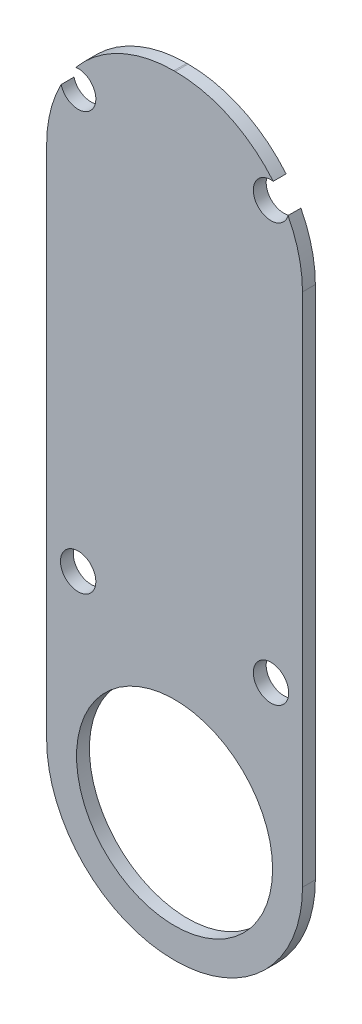
ISO-10303-21;
HEADER;
FILE_DESCRIPTION(('STEP AP214'),'2;1');
FILE_NAME('part.step','',(''),(''),'','','');
FILE_SCHEMA(('AUTOMOTIVE_DESIGN { 1 0 10303 214 1 1 1 1 }'));
ENDSEC;
DATA;
#1=APPLICATION_CONTEXT('core data for automotive mechanical design processes');
#2=APPLICATION_PROTOCOL_DEFINITION('international standard','automotive_design',2000,#1);
#3=PRODUCT_CONTEXT('',#1,'mechanical');
#4=PRODUCT('Part','Part','',(#3));
#5=PRODUCT_RELATED_PRODUCT_CATEGORY('part','',(#4));
#6=PRODUCT_DEFINITION_FORMATION('','',#4);
#7=PRODUCT_DEFINITION_CONTEXT('part definition',#1,'design');
#8=PRODUCT_DEFINITION('design','',#6,#7);
#9=PRODUCT_DEFINITION_SHAPE('','',#8);
#10=(LENGTH_UNIT() NAMED_UNIT(*) SI_UNIT(.MILLI.,.METRE.));
#11=(NAMED_UNIT(*) PLANE_ANGLE_UNIT() SI_UNIT($,.RADIAN.));
#12=(NAMED_UNIT(*) SI_UNIT($,.STERADIAN.) SOLID_ANGLE_UNIT());
#13=UNCERTAINTY_MEASURE_WITH_UNIT(LENGTH_MEASURE(1.E-05),#10,'distance_accuracy_value','');
#14=(GEOMETRIC_REPRESENTATION_CONTEXT(3) GLOBAL_UNCERTAINTY_ASSIGNED_CONTEXT((#13)) GLOBAL_UNIT_ASSIGNED_CONTEXT((#10,
#11,#12)) REPRESENTATION_CONTEXT('',''));
#15=CARTESIAN_POINT('',(0.,0.,0.));
#16=DIRECTION('',(0.,0.,1.));
#17=DIRECTION('',(1.,0.,0.));
#18=AXIS2_PLACEMENT_3D('',#15,#16,#17);
#19=CARTESIAN_POINT('',(100.1,-84.9,4.));
#20=DIRECTION('',(0.,0.,-1.));
#21=DIRECTION('',(-1.,0.,0.));
#22=AXIS2_PLACEMENT_3D('',#19,#20,#21);
#23=CYLINDRICAL_SURFACE('',#22,19.8);
#24=CARTESIAN_POINT('',(100.1,-84.9,2.));
#25=DIRECTION('',(0.,0.,1.));
#26=DIRECTION('',(1.,0.,0.));
#27=AXIS2_PLACEMENT_3D('',#24,#25,#26);
#28=CIRCLE('',#27,19.8);
#29=CARTESIAN_POINT('',(119.9,-84.9,2.));
#30=VERTEX_POINT('',#29);
#31=CARTESIAN_POINT('',(117.650369982477,-75.7335113877682,2.));
#32=VERTEX_POINT('',#31);
#33=EDGE_CURVE('E122',#30,#32,#28,.T.);
#34=ORIENTED_EDGE('',*,*,#33,.T.);
#35=DIRECTION('',(0.,0.,1.));
#36=VECTOR('',#35,1.);
#37=CARTESIAN_POINT('',(117.650369982477,-75.7335113877682,3.));
#38=LINE('',#37,#36);
#39=CARTESIAN_POINT('',(117.650369982477,-75.7335113877682,4.));
#40=VERTEX_POINT('',#39);
#41=EDGE_CURVE('E33',#32,#40,#38,.T.);
#42=ORIENTED_EDGE('',*,*,#41,.T.);
#43=CARTESIAN_POINT('',(100.1,-84.9,4.));
#44=DIRECTION('',(0.,0.,1.));
#45=DIRECTION('',(1.,0.,0.));
#46=AXIS2_PLACEMENT_3D('',#43,#44,#45);
#47=CIRCLE('',#46,19.8);
#48=CARTESIAN_POINT('',(119.9,-84.9,4.));
#49=VERTEX_POINT('',#48);
#50=EDGE_CURVE('E196',#49,#40,#47,.T.);
#51=ORIENTED_EDGE('',*,*,#50,.F.);
#52=DIRECTION('',(0.,0.,-1.));
#53=VECTOR('',#52,1.);
#54=CARTESIAN_POINT('',(119.9,-84.9,4.));
#55=LINE('',#54,#53);
#56=EDGE_CURVE('E146',#49,#30,#55,.T.);
#57=ORIENTED_EDGE('',*,*,#56,.T.);
#58=EDGE_LOOP('',(#34,#42,#51,#57));
#59=FACE_BOUND('',#58,.T.);
#60=ADVANCED_FACE('F16',(#59),#23,.T.);
#61=CARTESIAN_POINT('',(99.9,-84.9,4.));
#62=DIRECTION('',(0.,0.,-1.));
#63=DIRECTION('',(-1.,0.,0.));
#64=AXIS2_PLACEMENT_3D('',#61,#62,#63);
#65=CYLINDRICAL_SURFACE('',#64,19.8);
#66=CARTESIAN_POINT('',(99.9,-84.9,2.));
#67=DIRECTION('',(0.,0.,1.));
#68=DIRECTION('',(1.,0.,0.));
#69=AXIS2_PLACEMENT_3D('',#66,#67,#68);
#70=CIRCLE('',#69,19.8);
#71=CARTESIAN_POINT('',(99.9,-65.1,2.));
#72=VERTEX_POINT('',#71);
#73=CARTESIAN_POINT('',(84.6492552084002,-72.2724593328118,2.));
#74=VERTEX_POINT('',#73);
#75=EDGE_CURVE('E129',#72,#74,#70,.T.);
#76=ORIENTED_EDGE('',*,*,#75,.T.);
#77=DIRECTION('',(0.,0.,1.));
#78=VECTOR('',#77,1.);
#79=CARTESIAN_POINT('',(84.6492552084002,-72.2724593328118,3.));
#80=LINE('',#79,#78);
#81=CARTESIAN_POINT('',(84.6492552084002,-72.2724593328118,4.));
#82=VERTEX_POINT('',#81);
#83=EDGE_CURVE('E36',#74,#82,#80,.T.);
#84=ORIENTED_EDGE('',*,*,#83,.T.);
#85=CARTESIAN_POINT('',(99.9,-84.9,4.));
#86=DIRECTION('',(0.,0.,1.));
#87=DIRECTION('',(1.,0.,0.));
#88=AXIS2_PLACEMENT_3D('',#85,#86,#87);
#89=CIRCLE('',#88,19.8);
#90=CARTESIAN_POINT('',(99.9,-65.1,4.));
#91=VERTEX_POINT('',#90);
#92=EDGE_CURVE('E204',#91,#82,#89,.T.);
#93=ORIENTED_EDGE('',*,*,#92,.F.);
#94=DIRECTION('',(0.,0.,-1.));
#95=VECTOR('',#94,1.);
#96=CARTESIAN_POINT('',(99.9,-65.1,4.));
#97=LINE('',#96,#95);
#98=EDGE_CURVE('E141',#91,#72,#97,.T.);
#99=ORIENTED_EDGE('',*,*,#98,.T.);
#100=EDGE_LOOP('',(#76,#84,#93,#99));
#101=FACE_BOUND('',#100,.T.);
#102=ADVANCED_FACE('F243',(#101),#65,.T.);
#103=CARTESIAN_POINT('',(99.9,-165.1,4.));
#104=DIRECTION('',(0.,0.,-1.));
#105=DIRECTION('',(-1.,0.,0.));
#106=AXIS2_PLACEMENT_3D('',#103,#104,#105);
#107=CYLINDRICAL_SURFACE('',#106,19.8);
#108=CARTESIAN_POINT('',(99.9,-165.1,2.));
#109=DIRECTION('',(0.,0.,1.));
#110=DIRECTION('',(1.,0.,0.));
#111=AXIS2_PLACEMENT_3D('',#108,#109,#110);
#112=CIRCLE('',#111,19.8);
#113=CARTESIAN_POINT('',(80.1,-165.1,2.));
#114=VERTEX_POINT('',#113);
#115=CARTESIAN_POINT('',(99.9,-184.9,2.));
#116=VERTEX_POINT('',#115);
#117=EDGE_CURVE('E188',#114,#116,#112,.T.);
#118=ORIENTED_EDGE('',*,*,#117,.T.);
#119=DIRECTION('',(0.,0.,-1.));
#120=VECTOR('',#119,1.);
#121=CARTESIAN_POINT('',(99.9,-184.9,4.));
#122=LINE('',#121,#120);
#123=CARTESIAN_POINT('',(99.9,-184.9,4.));
#124=VERTEX_POINT('',#123);
#125=EDGE_CURVE('E160',#124,#116,#122,.T.);
#126=ORIENTED_EDGE('',*,*,#125,.F.);
#127=CARTESIAN_POINT('',(99.9,-165.1,4.));
#128=DIRECTION('',(0.,0.,1.));
#129=DIRECTION('',(1.,0.,0.));
#130=AXIS2_PLACEMENT_3D('',#127,#128,#129);
#131=CIRCLE('',#130,19.8);
#132=CARTESIAN_POINT('',(80.1,-165.1,4.));
#133=VERTEX_POINT('',#132);
#134=EDGE_CURVE('E134',#133,#124,#131,.T.);
#135=ORIENTED_EDGE('',*,*,#134,.F.);
#136=DIRECTION('',(0.,0.,-1.));
#137=VECTOR('',#136,1.);
#138=CARTESIAN_POINT('',(80.1,-165.1,4.));
#139=LINE('',#138,#137);
#140=EDGE_CURVE('E137',#133,#114,#139,.T.);
#141=ORIENTED_EDGE('',*,*,#140,.T.);
#142=EDGE_LOOP('',(#118,#126,#135,#141));
#143=FACE_BOUND('',#142,.T.);
#144=ADVANCED_FACE('F18',(#143),#107,.T.);
#145=CARTESIAN_POINT('',(99.9,-184.9,4.));
#146=DIRECTION('',(0.,1.,0.));
#147=DIRECTION('',(0.,0.,1.));
#148=AXIS2_PLACEMENT_3D('',#145,#146,#147);
#149=PLANE('',#148);
#150=DIRECTION('',(1.,0.,0.));
#151=VECTOR('',#150,1.);
#152=CARTESIAN_POINT('',(99.9,-184.9,2.));
#153=LINE('',#152,#151);
#154=CARTESIAN_POINT('',(100.1,-184.9,2.));
#155=VERTEX_POINT('',#154);
#156=EDGE_CURVE('E209',#116,#155,#153,.T.);
#157=ORIENTED_EDGE('',*,*,#156,.T.);
#158=DIRECTION('',(0.,0.,-1.));
#159=VECTOR('',#158,1.);
#160=CARTESIAN_POINT('',(100.1,-184.9,4.));
#161=LINE('',#160,#159);
#162=CARTESIAN_POINT('',(100.1,-184.9,4.));
#163=VERTEX_POINT('',#162);
#164=EDGE_CURVE('E152',#163,#155,#161,.T.);
#165=ORIENTED_EDGE('',*,*,#164,.F.);
#166=DIRECTION('',(1.,0.,0.));
#167=VECTOR('',#166,1.);
#168=CARTESIAN_POINT('',(99.9,-184.9,4.));
#169=LINE('',#168,#167);
#170=EDGE_CURVE('E195',#124,#163,#169,.T.);
#171=ORIENTED_EDGE('',*,*,#170,.F.);
#172=ORIENTED_EDGE('',*,*,#125,.T.);
#173=EDGE_LOOP('',(#157,#165,#171,#172));
#174=FACE_BOUND('',#173,.T.);
#175=ADVANCED_FACE('F230',(#174),#149,.F.);
#176=CARTESIAN_POINT('',(100.1,-165.1,4.));
#177=DIRECTION('',(0.,0.,-1.));
#178=DIRECTION('',(-1.,0.,0.));
#179=AXIS2_PLACEMENT_3D('',#176,#177,#178);
#180=CYLINDRICAL_SURFACE('',#179,19.8);
#181=CARTESIAN_POINT('',(100.1,-165.1,2.));
#182=DIRECTION('',(0.,0.,1.));
#183=DIRECTION('',(1.,0.,0.));
#184=AXIS2_PLACEMENT_3D('',#181,#182,#183);
#185=CIRCLE('',#184,19.8);
#186=CARTESIAN_POINT('',(119.9,-165.1,2.));
#187=VERTEX_POINT('',#186);
#188=EDGE_CURVE('E121',#155,#187,#185,.T.);
#189=ORIENTED_EDGE('',*,*,#188,.T.);
#190=DIRECTION('',(0.,0.,-1.));
#191=VECTOR('',#190,1.);
#192=CARTESIAN_POINT('',(119.9,-165.1,4.));
#193=LINE('',#192,#191);
#194=CARTESIAN_POINT('',(119.9,-165.1,4.));
#195=VERTEX_POINT('',#194);
#196=EDGE_CURVE('E151',#195,#187,#193,.T.);
#197=ORIENTED_EDGE('',*,*,#196,.F.);
#198=CARTESIAN_POINT('',(100.1,-165.1,4.));
#199=DIRECTION('',(0.,0.,1.));
#200=DIRECTION('',(1.,0.,0.));
#201=AXIS2_PLACEMENT_3D('',#198,#199,#200);
#202=CIRCLE('',#201,19.8);
#203=EDGE_CURVE('E191',#163,#195,#202,.T.);
#204=ORIENTED_EDGE('',*,*,#203,.F.);
#205=ORIENTED_EDGE('',*,*,#164,.T.);
#206=EDGE_LOOP('',(#189,#197,#204,#205));
#207=FACE_BOUND('',#206,.T.);
#208=ADVANCED_FACE('F212',(#207),#180,.T.);
#209=CARTESIAN_POINT('',(119.9,-165.1,4.));
#210=DIRECTION('',(-1.,0.,0.));
#211=DIRECTION('',(0.,0.,1.));
#212=AXIS2_PLACEMENT_3D('',#209,#210,#211);
#213=PLANE('',#212);
#214=DIRECTION('',(0.,1.,0.));
#215=VECTOR('',#214,1.);
#216=CARTESIAN_POINT('',(119.9,-165.1,2.));
#217=LINE('',#216,#215);
#218=EDGE_CURVE('E125',#187,#30,#217,.T.);
#219=ORIENTED_EDGE('',*,*,#218,.T.);
#220=ORIENTED_EDGE('',*,*,#56,.F.);
#221=DIRECTION('',(0.,1.,0.));
#222=VECTOR('',#221,1.);
#223=CARTESIAN_POINT('',(119.9,-165.1,4.));
#224=LINE('',#223,#222);
#225=EDGE_CURVE('E198',#195,#49,#224,.T.);
#226=ORIENTED_EDGE('',*,*,#225,.F.);
#227=ORIENTED_EDGE('',*,*,#196,.T.);
#228=EDGE_LOOP('',(#219,#220,#226,#227));
#229=FACE_BOUND('',#228,.T.);
#230=ADVANCED_FACE('F219',(#229),#213,.F.);
#231=CARTESIAN_POINT('',(115.3507447916,-72.2724593328118,4.));
#232=VERTEX_POINT('',#231);
#233=CARTESIAN_POINT('',(100.1,-65.1,4.));
#234=VERTEX_POINT('',#233);
#235=EDGE_CURVE('E113',#232,#234,#47,.T.);
#236=ORIENTED_EDGE('',*,*,#235,.F.);
#237=DIRECTION('',(0.,0.,1.));
#238=VECTOR('',#237,1.);
#239=CARTESIAN_POINT('',(115.3507447916,-72.2724593328118,3.));
#240=LINE('',#239,#238);
#241=CARTESIAN_POINT('',(115.3507447916,-72.2724593328118,2.));
#242=VERTEX_POINT('',#241);
#243=EDGE_CURVE('E103',#232,#242,#240,.F.);
#244=ORIENTED_EDGE('',*,*,#243,.T.);
#245=CARTESIAN_POINT('',(100.1,-65.1,2.));
#246=VERTEX_POINT('',#245);
#247=EDGE_CURVE('E114',#242,#246,#28,.T.);
#248=ORIENTED_EDGE('',*,*,#247,.T.);
#249=DIRECTION('',(0.,0.,-1.));
#250=VECTOR('',#249,1.);
#251=CARTESIAN_POINT('',(100.1,-65.1,4.));
#252=LINE('',#251,#250);
#253=EDGE_CURVE('E148',#234,#246,#252,.T.);
#254=ORIENTED_EDGE('',*,*,#253,.F.);
#255=EDGE_LOOP('',(#236,#244,#248,#254));
#256=FACE_BOUND('',#255,.T.);
#257=ADVANCED_FACE('F112',(#256),#23,.T.);
#258=CARTESIAN_POINT('',(100.1,-65.1,4.));
#259=DIRECTION('',(0.,-1.,0.));
#260=DIRECTION('',(0.,0.,-1.));
#261=AXIS2_PLACEMENT_3D('',#258,#259,#260);
#262=PLANE('',#261);
#263=DIRECTION('',(-1.,0.,0.));
#264=VECTOR('',#263,1.);
#265=CARTESIAN_POINT('',(100.1,-65.1,2.));
#266=LINE('',#265,#264);
#267=EDGE_CURVE('E120',#246,#72,#266,.T.);
#268=ORIENTED_EDGE('',*,*,#267,.T.);
#269=ORIENTED_EDGE('',*,*,#98,.F.);
#270=DIRECTION('',(-1.,0.,0.));
#271=VECTOR('',#270,1.);
#272=CARTESIAN_POINT('',(100.1,-65.1,4.));
#273=LINE('',#272,#271);
#274=EDGE_CURVE('E203',#234,#91,#273,.T.);
#275=ORIENTED_EDGE('',*,*,#274,.F.);
#276=ORIENTED_EDGE('',*,*,#253,.T.);
#277=EDGE_LOOP('',(#268,#269,#275,#276));
#278=FACE_BOUND('',#277,.T.);
#279=ADVANCED_FACE('F246',(#278),#262,.F.);
#280=CARTESIAN_POINT('',(82.3496300175231,-75.7335113877682,4.));
#281=VERTEX_POINT('',#280);
#282=CARTESIAN_POINT('',(80.1,-84.9,4.));
#283=VERTEX_POINT('',#282);
#284=EDGE_CURVE('E201',#281,#283,#89,.T.);
#285=ORIENTED_EDGE('',*,*,#284,.F.);
#286=DIRECTION('',(0.,0.,1.));
#287=VECTOR('',#286,1.);
#288=CARTESIAN_POINT('',(82.3496300175231,-75.7335113877682,3.));
#289=LINE('',#288,#287);
#290=CARTESIAN_POINT('',(82.3496300175231,-75.7335113877682,2.));
#291=VERTEX_POINT('',#290);
#292=EDGE_CURVE('E177',#281,#291,#289,.F.);
#293=ORIENTED_EDGE('',*,*,#292,.T.);
#294=CARTESIAN_POINT('',(80.1,-84.9,2.));
#295=VERTEX_POINT('',#294);
#296=EDGE_CURVE('E127',#291,#295,#70,.T.);
#297=ORIENTED_EDGE('',*,*,#296,.T.);
#298=DIRECTION('',(0.,0.,-1.));
#299=VECTOR('',#298,1.);
#300=CARTESIAN_POINT('',(80.1,-84.9,4.));
#301=LINE('',#300,#299);
#302=EDGE_CURVE('E136',#283,#295,#301,.T.);
#303=ORIENTED_EDGE('',*,*,#302,.F.);
#304=EDGE_LOOP('',(#285,#293,#297,#303));
#305=FACE_BOUND('',#304,.T.);
#306=ADVANCED_FACE('F245',(#305),#65,.T.);
#307=CARTESIAN_POINT('',(80.1,-84.9,4.));
#308=DIRECTION('',(1.,0.,0.));
#309=DIRECTION('',(0.,0.,-1.));
#310=AXIS2_PLACEMENT_3D('',#307,#308,#309);
#311=PLANE('',#310);
#312=DIRECTION('',(0.,-1.,0.));
#313=VECTOR('',#312,1.);
#314=CARTESIAN_POINT('',(80.1,-84.9,2.));
#315=LINE('',#314,#313);
#316=EDGE_CURVE('E132',#295,#114,#315,.T.);
#317=ORIENTED_EDGE('',*,*,#316,.T.);
#318=ORIENTED_EDGE('',*,*,#140,.F.);
#319=DIRECTION('',(0.,-1.,0.));
#320=VECTOR('',#319,1.);
#321=CARTESIAN_POINT('',(80.1,-84.9,4.));
#322=LINE('',#321,#320);
#323=EDGE_CURVE('E138',#283,#133,#322,.T.);
#324=ORIENTED_EDGE('',*,*,#323,.F.);
#325=ORIENTED_EDGE('',*,*,#302,.T.);
#326=EDGE_LOOP('',(#317,#318,#324,#325));
#327=FACE_BOUND('',#326,.T.);
#328=ADVANCED_FACE('F238',(#327),#311,.F.);
#329=CARTESIAN_POINT('',(99.9,-165.1,4.));
#330=DIRECTION('',(0.,0.,1.));
#331=DIRECTION('',(1.,0.,0.));
#332=AXIS2_PLACEMENT_3D('',#329,#330,#331);
#333=PLANE('',#332);
#334=CARTESIAN_POINT('',(115.,-75.,4.));
#335=DIRECTION('',(0.,0.,1.));
#336=DIRECTION('',(1.,0.,0.));
#337=AXIS2_PLACEMENT_3D('',#334,#335,#336);
#338=CIRCLE('',#337,2.75);
#339=EDGE_CURVE('E172',#232,#40,#338,.T.);
#340=ORIENTED_EDGE('',*,*,#339,.F.);
#341=ORIENTED_EDGE('',*,*,#235,.T.);
#342=ORIENTED_EDGE('',*,*,#274,.T.);
#343=ORIENTED_EDGE('',*,*,#92,.T.);
#344=CARTESIAN_POINT('',(85.,-75.,4.));
#345=DIRECTION('',(0.,0.,1.));
#346=DIRECTION('',(1.,0.,0.));
#347=AXIS2_PLACEMENT_3D('',#344,#345,#346);
#348=CIRCLE('',#347,2.75);
#349=EDGE_CURVE('E169',#281,#82,#348,.T.);
#350=ORIENTED_EDGE('',*,*,#349,.F.);
#351=ORIENTED_EDGE('',*,*,#284,.T.);
#352=ORIENTED_EDGE('',*,*,#323,.T.);
#353=ORIENTED_EDGE('',*,*,#134,.T.);
#354=ORIENTED_EDGE('',*,*,#170,.T.);
#355=ORIENTED_EDGE('',*,*,#203,.T.);
#356=ORIENTED_EDGE('',*,*,#225,.T.);
#357=ORIENTED_EDGE('',*,*,#50,.T.);
#358=EDGE_LOOP('',(#340,#341,#342,#343,#350,#351,#352,#353,#354,#355,#356,#357));
#359=FACE_BOUND('',#358,.T.);
#360=CARTESIAN_POINT('',(115.,-140.,4.));
#361=DIRECTION('',(0.,0.,1.));
#362=DIRECTION('',(1.,0.,0.));
#363=AXIS2_PLACEMENT_3D('',#360,#361,#362);
#364=CIRCLE('',#363,2.75);
#365=CARTESIAN_POINT('',(117.75,-140.,4.));
#366=VERTEX_POINT('',#365);
#367=EDGE_CURVE('E171',#366,#366,#364,.T.);
#368=ORIENTED_EDGE('',*,*,#367,.F.);
#369=EDGE_LOOP('',(#368));
#370=FACE_BOUND('',#369,.T.);
#371=CARTESIAN_POINT('',(85.,-140.,4.));
#372=DIRECTION('',(0.,0.,1.));
#373=DIRECTION('',(1.,0.,0.));
#374=AXIS2_PLACEMENT_3D('',#371,#372,#373);
#375=CIRCLE('',#374,2.75);
#376=CARTESIAN_POINT('',(87.75,-140.,4.));
#377=VERTEX_POINT('',#376);
#378=EDGE_CURVE('E163',#377,#377,#375,.T.);
#379=ORIENTED_EDGE('',*,*,#378,.F.);
#380=EDGE_LOOP('',(#379));
#381=FACE_BOUND('',#380,.T.);
#382=CARTESIAN_POINT('',(100.,-165.,4.));
#383=DIRECTION('',(0.,0.,1.));
#384=DIRECTION('',(1.,0.,0.));
#385=AXIS2_PLACEMENT_3D('',#382,#383,#384);
#386=CIRCLE('',#385,15.25);
#387=CARTESIAN_POINT('',(115.25,-165.,4.));
#388=VERTEX_POINT('',#387);
#389=EDGE_CURVE('E162',#388,#388,#386,.T.);
#390=ORIENTED_EDGE('',*,*,#389,.F.);
#391=EDGE_LOOP('',(#390));
#392=FACE_BOUND('',#391,.T.);
#393=ADVANCED_FACE('F223',(#359,#370,#381,#392),#333,.T.);
#394=CARTESIAN_POINT('',(99.9,-165.1,2.));
#395=DIRECTION('',(0.,0.,1.));
#396=DIRECTION('',(1.,0.,0.));
#397=AXIS2_PLACEMENT_3D('',#394,#395,#396);
#398=PLANE('',#397);
#399=CARTESIAN_POINT('',(115.,-140.,2.));
#400=DIRECTION('',(0.,0.,1.));
#401=DIRECTION('',(1.,0.,0.));
#402=AXIS2_PLACEMENT_3D('',#399,#400,#401);
#403=CIRCLE('',#402,2.75);
#404=CARTESIAN_POINT('',(117.75,-140.,2.));
#405=VERTEX_POINT('',#404);
#406=EDGE_CURVE('E166',#405,#405,#403,.T.);
#407=ORIENTED_EDGE('',*,*,#406,.T.);
#408=EDGE_LOOP('',(#407));
#409=FACE_BOUND('',#408,.T.);
#410=CARTESIAN_POINT('',(85.,-140.,2.));
#411=DIRECTION('',(0.,0.,1.));
#412=DIRECTION('',(1.,0.,0.));
#413=AXIS2_PLACEMENT_3D('',#410,#411,#412);
#414=CIRCLE('',#413,2.75);
#415=CARTESIAN_POINT('',(87.75,-140.,2.));
#416=VERTEX_POINT('',#415);
#417=EDGE_CURVE('E164',#416,#416,#414,.T.);
#418=ORIENTED_EDGE('',*,*,#417,.T.);
#419=EDGE_LOOP('',(#418));
#420=FACE_BOUND('',#419,.T.);
#421=CARTESIAN_POINT('',(100.,-165.,2.));
#422=DIRECTION('',(0.,0.,1.));
#423=DIRECTION('',(1.,0.,0.));
#424=AXIS2_PLACEMENT_3D('',#421,#422,#423);
#425=CIRCLE('',#424,15.25);
#426=CARTESIAN_POINT('',(115.25,-165.,2.));
#427=VERTEX_POINT('',#426);
#428=EDGE_CURVE('E159',#427,#427,#425,.T.);
#429=ORIENTED_EDGE('',*,*,#428,.T.);
#430=EDGE_LOOP('',(#429));
#431=FACE_BOUND('',#430,.T.);
#432=ORIENTED_EDGE('',*,*,#247,.F.);
#433=CARTESIAN_POINT('',(115.,-75.,2.));
#434=DIRECTION('',(0.,0.,1.));
#435=DIRECTION('',(1.,0.,0.));
#436=AXIS2_PLACEMENT_3D('',#433,#434,#435);
#437=CIRCLE('',#436,2.75);
#438=EDGE_CURVE('E10',#242,#32,#437,.T.);
#439=ORIENTED_EDGE('',*,*,#438,.T.);
#440=ORIENTED_EDGE('',*,*,#33,.F.);
#441=ORIENTED_EDGE('',*,*,#218,.F.);
#442=ORIENTED_EDGE('',*,*,#188,.F.);
#443=ORIENTED_EDGE('',*,*,#156,.F.);
#444=ORIENTED_EDGE('',*,*,#117,.F.);
#445=ORIENTED_EDGE('',*,*,#316,.F.);
#446=ORIENTED_EDGE('',*,*,#296,.F.);
#447=CARTESIAN_POINT('',(85.,-75.,2.));
#448=DIRECTION('',(0.,0.,1.));
#449=DIRECTION('',(1.,0.,0.));
#450=AXIS2_PLACEMENT_3D('',#447,#448,#449);
#451=CIRCLE('',#450,2.75);
#452=EDGE_CURVE('E24',#291,#74,#451,.T.);
#453=ORIENTED_EDGE('',*,*,#452,.T.);
#454=ORIENTED_EDGE('',*,*,#75,.F.);
#455=ORIENTED_EDGE('',*,*,#267,.F.);
#456=EDGE_LOOP('',(#432,#439,#440,#441,#442,#443,#444,#445,#446,#453,#454,#455));
#457=FACE_BOUND('',#456,.T.);
#458=ADVANCED_FACE('F119',(#409,#420,#431,#457),#398,.F.);
#459=CARTESIAN_POINT('',(100.,-165.,1.9));
#460=DIRECTION('',(0.,0.,1.));
#461=DIRECTION('',(1.,0.,0.));
#462=AXIS2_PLACEMENT_3D('',#459,#460,#461);
#463=CYLINDRICAL_SURFACE('',#462,15.25);
#464=ORIENTED_EDGE('',*,*,#389,.T.);
#465=EDGE_LOOP('',(#464));
#466=FACE_BOUND('',#465,.T.);
#467=ORIENTED_EDGE('',*,*,#428,.F.);
#468=EDGE_LOOP('',(#467));
#469=FACE_BOUND('',#468,.T.);
#470=ADVANCED_FACE('F263',(#466,#469),#463,.F.);
#471=CARTESIAN_POINT('',(85.,-140.,1.9));
#472=DIRECTION('',(0.,0.,1.));
#473=DIRECTION('',(1.,0.,0.));
#474=AXIS2_PLACEMENT_3D('',#471,#472,#473);
#475=CYLINDRICAL_SURFACE('',#474,2.75);
#476=ORIENTED_EDGE('',*,*,#378,.T.);
#477=EDGE_LOOP('',(#476));
#478=FACE_BOUND('',#477,.T.);
#479=ORIENTED_EDGE('',*,*,#417,.F.);
#480=EDGE_LOOP('',(#479));
#481=FACE_BOUND('',#480,.T.);
#482=ADVANCED_FACE('F255',(#478,#481),#475,.F.);
#483=CARTESIAN_POINT('',(85.,-75.,1.9));
#484=DIRECTION('',(0.,0.,1.));
#485=DIRECTION('',(1.,0.,0.));
#486=AXIS2_PLACEMENT_3D('',#483,#484,#485);
#487=CYLINDRICAL_SURFACE('',#486,2.75);
#488=ORIENTED_EDGE('',*,*,#349,.T.);
#489=ORIENTED_EDGE('',*,*,#83,.F.);
#490=ORIENTED_EDGE('',*,*,#452,.F.);
#491=ORIENTED_EDGE('',*,*,#292,.F.);
#492=EDGE_LOOP('',(#488,#489,#490,#491));
#493=FACE_BOUND('',#492,.T.);
#494=ADVANCED_FACE('F253',(#493),#487,.F.);
#495=CARTESIAN_POINT('',(115.,-140.,1.9));
#496=DIRECTION('',(0.,0.,1.));
#497=DIRECTION('',(1.,0.,0.));
#498=AXIS2_PLACEMENT_3D('',#495,#496,#497);
#499=CYLINDRICAL_SURFACE('',#498,2.75);
#500=ORIENTED_EDGE('',*,*,#367,.T.);
#501=EDGE_LOOP('',(#500));
#502=FACE_BOUND('',#501,.T.);
#503=ORIENTED_EDGE('',*,*,#406,.F.);
#504=EDGE_LOOP('',(#503));
#505=FACE_BOUND('',#504,.T.);
#506=ADVANCED_FACE('F251',(#502,#505),#499,.F.);
#507=CARTESIAN_POINT('',(115.,-75.,1.9));
#508=DIRECTION('',(0.,0.,1.));
#509=DIRECTION('',(1.,0.,0.));
#510=AXIS2_PLACEMENT_3D('',#507,#508,#509);
#511=CYLINDRICAL_SURFACE('',#510,2.75);
#512=ORIENTED_EDGE('',*,*,#339,.T.);
#513=ORIENTED_EDGE('',*,*,#41,.F.);
#514=ORIENTED_EDGE('',*,*,#438,.F.);
#515=ORIENTED_EDGE('',*,*,#243,.F.);
#516=EDGE_LOOP('',(#512,#513,#514,#515));
#517=FACE_BOUND('',#516,.T.);
#518=ADVANCED_FACE('F105',(#517),#511,.F.);
#519=CLOSED_SHELL('',(#60,#102,#144,#175,#208,#230,#257,#279,#306,#328,#393,#458,#470,#482,#494,
#506,#518));
#520=MANIFOLD_SOLID_BREP('B1',#519);
#521=ADVANCED_BREP_SHAPE_REPRESENTATION('',(#18,#520),#14);
#522=SHAPE_DEFINITION_REPRESENTATION(#9,#521);
ENDSEC;
END-ISO-10303-21;
